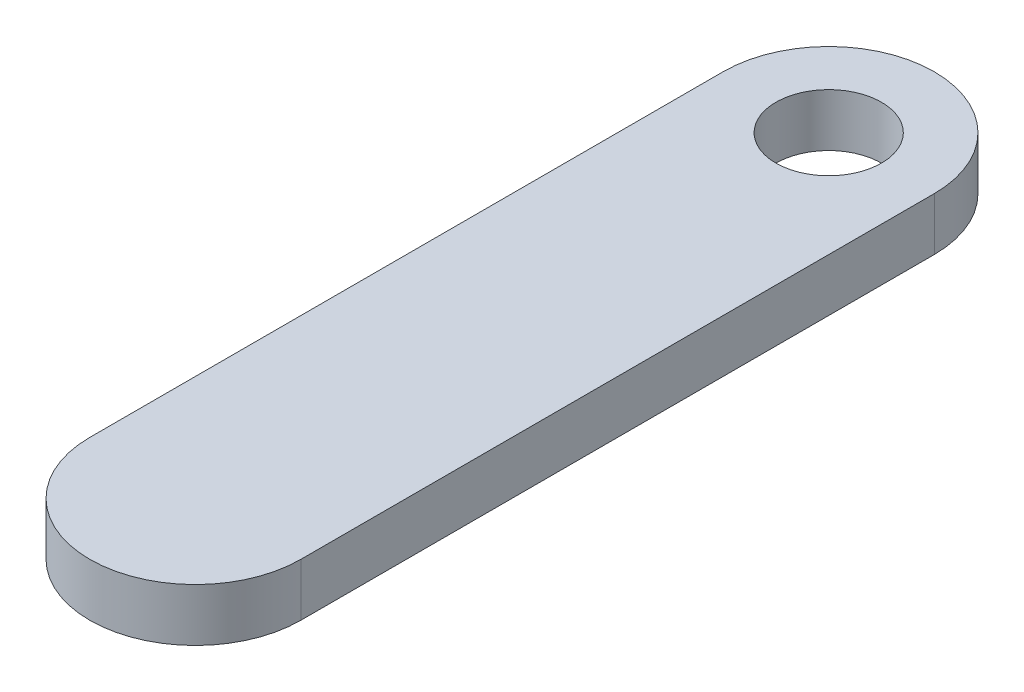
ISO-10303-21;
HEADER;
FILE_DESCRIPTION(('STEP AP214'),'2;1');
FILE_NAME('part.step','',(''),(''),'','','');
FILE_SCHEMA(('AUTOMOTIVE_DESIGN { 1 0 10303 214 1 1 1 1 }'));
ENDSEC;
DATA;
#1=APPLICATION_CONTEXT('core data for automotive mechanical design processes');
#2=APPLICATION_PROTOCOL_DEFINITION('international standard','automotive_design',2000,#1);
#3=PRODUCT_CONTEXT('',#1,'mechanical');
#4=PRODUCT('Part','Part','',(#3));
#5=PRODUCT_RELATED_PRODUCT_CATEGORY('part','',(#4));
#6=PRODUCT_DEFINITION_FORMATION('','',#4);
#7=PRODUCT_DEFINITION_CONTEXT('part definition',#1,'design');
#8=PRODUCT_DEFINITION('design','',#6,#7);
#9=PRODUCT_DEFINITION_SHAPE('','',#8);
#10=(LENGTH_UNIT() NAMED_UNIT(*) SI_UNIT(.MILLI.,.METRE.));
#11=(NAMED_UNIT(*) PLANE_ANGLE_UNIT() SI_UNIT($,.RADIAN.));
#12=(NAMED_UNIT(*) SI_UNIT($,.STERADIAN.) SOLID_ANGLE_UNIT());
#13=UNCERTAINTY_MEASURE_WITH_UNIT(LENGTH_MEASURE(1.E-05),#10,'distance_accuracy_value','');
#14=(GEOMETRIC_REPRESENTATION_CONTEXT(3) GLOBAL_UNCERTAINTY_ASSIGNED_CONTEXT((#13)) GLOBAL_UNIT_ASSIGNED_CONTEXT((#10,
#11,#12)) REPRESENTATION_CONTEXT('',''));
#15=CARTESIAN_POINT('',(0.,0.,0.));
#16=DIRECTION('',(0.,0.,1.));
#17=DIRECTION('',(1.,0.,0.));
#18=AXIS2_PLACEMENT_3D('',#15,#16,#17);
#19=CARTESIAN_POINT('',(0.,6.35,0.));
#20=DIRECTION('',(0.,1.,0.));
#21=DIRECTION('',(0.,0.,1.));
#22=AXIS2_PLACEMENT_3D('',#19,#20,#21);
#23=PLANE('',#22);
#24=CARTESIAN_POINT('',(0.,6.35,0.));
#25=DIRECTION('',(0.,1.,0.));
#26=DIRECTION('',(0.,0.,1.));
#27=AXIS2_PLACEMENT_3D('',#24,#25,#26);
#28=CIRCLE('',#27,12.7);
#29=CARTESIAN_POINT('',(12.7,6.35,0.));
#30=VERTEX_POINT('',#29);
#31=CARTESIAN_POINT('',(-12.7,6.35,0.));
#32=VERTEX_POINT('',#31);
#33=EDGE_CURVE('E85',#30,#32,#28,.T.);
#34=ORIENTED_EDGE('',*,*,#33,.T.);
#35=DIRECTION('',(0.,0.,1.));
#36=VECTOR('',#35,1.);
#37=CARTESIAN_POINT('',(-12.7,6.35,0.));
#38=LINE('',#37,#36);
#39=CARTESIAN_POINT('',(-12.7,6.35,76.2));
#40=VERTEX_POINT('',#39);
#41=EDGE_CURVE('E80',#32,#40,#38,.T.);
#42=ORIENTED_EDGE('',*,*,#41,.T.);
#43=CARTESIAN_POINT('',(0.,6.35,76.2));
#44=DIRECTION('',(0.,1.,0.));
#45=DIRECTION('',(0.,0.,1.));
#46=AXIS2_PLACEMENT_3D('',#43,#44,#45);
#47=CIRCLE('',#46,12.7);
#48=CARTESIAN_POINT('',(12.7,6.35,76.2));
#49=VERTEX_POINT('',#48);
#50=EDGE_CURVE('E83',#40,#49,#47,.T.);
#51=ORIENTED_EDGE('',*,*,#50,.T.);
#52=DIRECTION('',(0.,0.,-1.));
#53=VECTOR('',#52,1.);
#54=CARTESIAN_POINT('',(12.7,6.35,0.));
#55=LINE('',#54,#53);
#56=EDGE_CURVE('E50',#49,#30,#55,.T.);
#57=ORIENTED_EDGE('',*,*,#56,.T.);
#58=EDGE_LOOP('',(#34,#42,#51,#57));
#59=FACE_BOUND('',#58,.T.);
#60=CARTESIAN_POINT('',(0.,6.35,0.));
#61=DIRECTION('',(0.,1.,0.));
#62=DIRECTION('',(0.,0.,1.));
#63=AXIS2_PLACEMENT_3D('',#60,#61,#62);
#64=CIRCLE('',#63,6.35);
#65=CARTESIAN_POINT('',(0.,6.35,6.35));
#66=VERTEX_POINT('',#65);
#67=EDGE_CURVE('E100',#66,#66,#64,.T.);
#68=ORIENTED_EDGE('',*,*,#67,.F.);
#69=EDGE_LOOP('',(#68));
#70=FACE_BOUND('',#69,.T.);
#71=ADVANCED_FACE('F33',(#59,#70),#23,.T.);
#72=CARTESIAN_POINT('',(0.,0.,0.));
#73=DIRECTION('',(0.,1.,0.));
#74=DIRECTION('',(0.,0.,1.));
#75=AXIS2_PLACEMENT_3D('',#72,#73,#74);
#76=PLANE('',#75);
#77=CARTESIAN_POINT('',(0.,0.,0.));
#78=DIRECTION('',(0.,1.,0.));
#79=DIRECTION('',(0.,0.,1.));
#80=AXIS2_PLACEMENT_3D('',#77,#78,#79);
#81=CIRCLE('',#80,12.7);
#82=CARTESIAN_POINT('',(12.7,0.,0.));
#83=VERTEX_POINT('',#82);
#84=CARTESIAN_POINT('',(-12.7,0.,0.));
#85=VERTEX_POINT('',#84);
#86=EDGE_CURVE('E97',#83,#85,#81,.T.);
#87=ORIENTED_EDGE('',*,*,#86,.F.);
#88=DIRECTION('',(0.,0.,-1.));
#89=VECTOR('',#88,1.);
#90=CARTESIAN_POINT('',(12.7,0.,0.));
#91=LINE('',#90,#89);
#92=CARTESIAN_POINT('',(12.7,0.,76.2));
#93=VERTEX_POINT('',#92);
#94=EDGE_CURVE('E73',#93,#83,#91,.T.);
#95=ORIENTED_EDGE('',*,*,#94,.F.);
#96=CARTESIAN_POINT('',(0.,0.,76.2));
#97=DIRECTION('',(0.,1.,0.));
#98=DIRECTION('',(0.,0.,1.));
#99=AXIS2_PLACEMENT_3D('',#96,#97,#98);
#100=CIRCLE('',#99,12.7);
#101=CARTESIAN_POINT('',(-12.7,0.,76.2));
#102=VERTEX_POINT('',#101);
#103=EDGE_CURVE('E67',#102,#93,#100,.T.);
#104=ORIENTED_EDGE('',*,*,#103,.F.);
#105=DIRECTION('',(0.,0.,1.));
#106=VECTOR('',#105,1.);
#107=CARTESIAN_POINT('',(-12.7,0.,0.));
#108=LINE('',#107,#106);
#109=EDGE_CURVE('E89',#85,#102,#108,.T.);
#110=ORIENTED_EDGE('',*,*,#109,.F.);
#111=EDGE_LOOP('',(#87,#95,#104,#110));
#112=FACE_BOUND('',#111,.T.);
#113=CARTESIAN_POINT('',(0.,0.,0.));
#114=DIRECTION('',(0.,1.,0.));
#115=DIRECTION('',(0.,0.,1.));
#116=AXIS2_PLACEMENT_3D('',#113,#114,#115);
#117=CIRCLE('',#116,6.35);
#118=CARTESIAN_POINT('',(0.,0.,6.35));
#119=VERTEX_POINT('',#118);
#120=EDGE_CURVE('E112',#119,#119,#117,.T.);
#121=ORIENTED_EDGE('',*,*,#120,.T.);
#122=EDGE_LOOP('',(#121));
#123=FACE_BOUND('',#122,.T.);
#124=ADVANCED_FACE('F108',(#112,#123),#76,.F.);
#125=CARTESIAN_POINT('',(0.,6.35,0.));
#126=DIRECTION('',(0.,-1.,0.));
#127=DIRECTION('',(0.,0.,-1.));
#128=AXIS2_PLACEMENT_3D('',#125,#126,#127);
#129=CYLINDRICAL_SURFACE('',#128,12.7);
#130=ORIENTED_EDGE('',*,*,#86,.T.);
#131=DIRECTION('',(0.,-1.,0.));
#132=VECTOR('',#131,1.);
#133=CARTESIAN_POINT('',(-12.7,6.35,0.));
#134=LINE('',#133,#132);
#135=EDGE_CURVE('E11',#32,#85,#134,.T.);
#136=ORIENTED_EDGE('',*,*,#135,.F.);
#137=ORIENTED_EDGE('',*,*,#33,.F.);
#138=DIRECTION('',(0.,-1.,0.));
#139=VECTOR('',#138,1.);
#140=CARTESIAN_POINT('',(12.7,6.35,0.));
#141=LINE('',#140,#139);
#142=EDGE_CURVE('E93',#30,#83,#141,.T.);
#143=ORIENTED_EDGE('',*,*,#142,.T.);
#144=EDGE_LOOP('',(#130,#136,#137,#143));
#145=FACE_BOUND('',#144,.T.);
#146=ADVANCED_FACE('F35',(#145),#129,.T.);
#147=CARTESIAN_POINT('',(-12.7,6.35,0.));
#148=DIRECTION('',(1.,0.,0.));
#149=DIRECTION('',(0.,0.,-1.));
#150=AXIS2_PLACEMENT_3D('',#147,#148,#149);
#151=PLANE('',#150);
#152=ORIENTED_EDGE('',*,*,#109,.T.);
#153=DIRECTION('',(0.,-1.,0.));
#154=VECTOR('',#153,1.);
#155=CARTESIAN_POINT('',(-12.7,6.35,76.2));
#156=LINE('',#155,#154);
#157=EDGE_CURVE('E42',#40,#102,#156,.T.);
#158=ORIENTED_EDGE('',*,*,#157,.F.);
#159=ORIENTED_EDGE('',*,*,#41,.F.);
#160=ORIENTED_EDGE('',*,*,#135,.T.);
#161=EDGE_LOOP('',(#152,#158,#159,#160));
#162=FACE_BOUND('',#161,.T.);
#163=ADVANCED_FACE('F88',(#162),#151,.F.);
#164=CARTESIAN_POINT('',(0.,6.35,76.2));
#165=DIRECTION('',(0.,-1.,0.));
#166=DIRECTION('',(0.,0.,-1.));
#167=AXIS2_PLACEMENT_3D('',#164,#165,#166);
#168=CYLINDRICAL_SURFACE('',#167,12.7);
#169=ORIENTED_EDGE('',*,*,#103,.T.);
#170=DIRECTION('',(0.,-1.,0.));
#171=VECTOR('',#170,1.);
#172=CARTESIAN_POINT('',(12.7,6.35,76.2));
#173=LINE('',#172,#171);
#174=EDGE_CURVE('E90',#49,#93,#173,.T.);
#175=ORIENTED_EDGE('',*,*,#174,.F.);
#176=ORIENTED_EDGE('',*,*,#50,.F.);
#177=ORIENTED_EDGE('',*,*,#157,.T.);
#178=EDGE_LOOP('',(#169,#175,#176,#177));
#179=FACE_BOUND('',#178,.T.);
#180=ADVANCED_FACE('F91',(#179),#168,.T.);
#181=CARTESIAN_POINT('',(12.7,6.35,0.));
#182=DIRECTION('',(-1.,0.,0.));
#183=DIRECTION('',(0.,0.,1.));
#184=AXIS2_PLACEMENT_3D('',#181,#182,#183);
#185=PLANE('',#184);
#186=ORIENTED_EDGE('',*,*,#94,.T.);
#187=ORIENTED_EDGE('',*,*,#142,.F.);
#188=ORIENTED_EDGE('',*,*,#56,.F.);
#189=ORIENTED_EDGE('',*,*,#174,.T.);
#190=EDGE_LOOP('',(#186,#187,#188,#189));
#191=FACE_BOUND('',#190,.T.);
#192=ADVANCED_FACE('F105',(#191),#185,.F.);
#193=CARTESIAN_POINT('',(0.,6.35,0.));
#194=DIRECTION('',(0.,-1.,0.));
#195=DIRECTION('',(0.,0.,-1.));
#196=AXIS2_PLACEMENT_3D('',#193,#194,#195);
#197=CYLINDRICAL_SURFACE('',#196,6.35);
#198=ORIENTED_EDGE('',*,*,#67,.T.);
#199=EDGE_LOOP('',(#198));
#200=FACE_BOUND('',#199,.T.);
#201=ORIENTED_EDGE('',*,*,#120,.F.);
#202=EDGE_LOOP('',(#201));
#203=FACE_BOUND('',#202,.T.);
#204=ADVANCED_FACE('F118',(#200,#203),#197,.F.);
#205=CLOSED_SHELL('',(#71,#124,#146,#163,#180,#192,#204));
#206=MANIFOLD_SOLID_BREP('B2',#205);
#207=ADVANCED_BREP_SHAPE_REPRESENTATION('',(#18,#206),#14);
#208=SHAPE_DEFINITION_REPRESENTATION(#9,#207);
ENDSEC;
END-ISO-10303-21;
